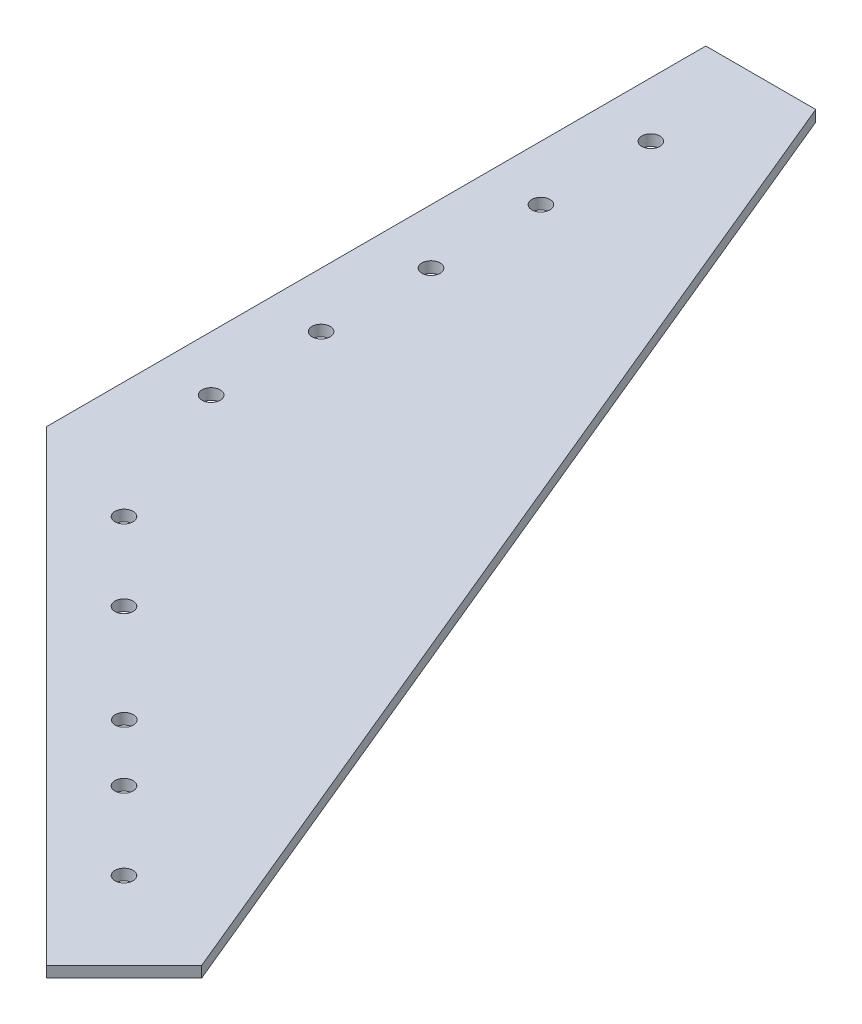
ISO-10303-21;
HEADER;
FILE_DESCRIPTION(('STEP AP214'),'2;1');
FILE_NAME('part.step','',(''),(''),'','','');
FILE_SCHEMA(('AUTOMOTIVE_DESIGN { 1 0 10303 214 1 1 1 1 }'));
ENDSEC;
DATA;
#1=APPLICATION_CONTEXT('core data for automotive mechanical design processes');
#2=APPLICATION_PROTOCOL_DEFINITION('international standard','automotive_design',2000,#1);
#3=PRODUCT_CONTEXT('',#1,'mechanical');
#4=PRODUCT('Part','Part','',(#3));
#5=PRODUCT_RELATED_PRODUCT_CATEGORY('part','',(#4));
#6=PRODUCT_DEFINITION_FORMATION('','',#4);
#7=PRODUCT_DEFINITION_CONTEXT('part definition',#1,'design');
#8=PRODUCT_DEFINITION('design','',#6,#7);
#9=PRODUCT_DEFINITION_SHAPE('','',#8);
#10=(LENGTH_UNIT() NAMED_UNIT(*) SI_UNIT(.MILLI.,.METRE.));
#11=(NAMED_UNIT(*) PLANE_ANGLE_UNIT() SI_UNIT($,.RADIAN.));
#12=(NAMED_UNIT(*) SI_UNIT($,.STERADIAN.) SOLID_ANGLE_UNIT());
#13=UNCERTAINTY_MEASURE_WITH_UNIT(LENGTH_MEASURE(1.E-05),#10,'distance_accuracy_value','');
#14=(GEOMETRIC_REPRESENTATION_CONTEXT(3) GLOBAL_UNCERTAINTY_ASSIGNED_CONTEXT((#13)) GLOBAL_UNIT_ASSIGNED_CONTEXT((#10,
#11,#12)) REPRESENTATION_CONTEXT('',''));
#15=CARTESIAN_POINT('',(0.,0.,0.));
#16=DIRECTION('',(0.,0.,1.));
#17=DIRECTION('',(1.,0.,0.));
#18=AXIS2_PLACEMENT_3D('',#15,#16,#17);
#19=CARTESIAN_POINT('',(0.,2.54,0.));
#20=DIRECTION('',(0.,0.,1.));
#21=DIRECTION('',(1.,0.,0.));
#22=AXIS2_PLACEMENT_3D('',#19,#20,#21);
#23=PLANE('',#22);
#24=DIRECTION('',(-1.,0.,0.));
#25=VECTOR('',#24,1.);
#26=CARTESIAN_POINT('',(0.,0.,0.));
#27=LINE('',#26,#25);
#28=CARTESIAN_POINT('',(25.4,0.,0.));
#29=VERTEX_POINT('',#28);
#30=CARTESIAN_POINT('',(0.,0.,0.));
#31=VERTEX_POINT('',#30);
#32=EDGE_CURVE('E129',#29,#31,#27,.T.);
#33=ORIENTED_EDGE('',*,*,#32,.T.);
#34=DIRECTION('',(0.,-1.,0.));
#35=VECTOR('',#34,1.);
#36=CARTESIAN_POINT('',(0.,2.54,0.));
#37=LINE('',#36,#35);
#38=CARTESIAN_POINT('',(0.,2.54,0.));
#39=VERTEX_POINT('',#38);
#40=EDGE_CURVE('E11',#39,#31,#37,.T.);
#41=ORIENTED_EDGE('',*,*,#40,.F.);
#42=DIRECTION('',(-1.,0.,0.));
#43=VECTOR('',#42,1.);
#44=CARTESIAN_POINT('',(0.,2.54,0.));
#45=LINE('',#44,#43);
#46=CARTESIAN_POINT('',(25.4,2.54,0.));
#47=VERTEX_POINT('',#46);
#48=EDGE_CURVE('E143',#47,#39,#45,.T.);
#49=ORIENTED_EDGE('',*,*,#48,.F.);
#50=DIRECTION('',(0.,-1.,0.));
#51=VECTOR('',#50,1.);
#52=CARTESIAN_POINT('',(25.4,2.54,0.));
#53=LINE('',#52,#51);
#54=EDGE_CURVE('E125',#47,#29,#53,.T.);
#55=ORIENTED_EDGE('',*,*,#54,.T.);
#56=EDGE_LOOP('',(#33,#41,#49,#55));
#57=FACE_BOUND('',#56,.T.);
#58=ADVANCED_FACE('F39',(#57),#23,.F.);
#59=CARTESIAN_POINT('',(0.,2.54,0.));
#60=DIRECTION('',(1.,0.,0.));
#61=DIRECTION('',(0.,0.,-1.));
#62=AXIS2_PLACEMENT_3D('',#59,#60,#61);
#63=PLANE('',#62);
#64=DIRECTION('',(0.,0.,1.));
#65=VECTOR('',#64,1.);
#66=CARTESIAN_POINT('',(0.,0.,0.));
#67=LINE('',#66,#65);
#68=CARTESIAN_POINT('',(0.,0.,152.4));
#69=VERTEX_POINT('',#68);
#70=EDGE_CURVE('E133',#31,#69,#67,.T.);
#71=ORIENTED_EDGE('',*,*,#70,.T.);
#72=DIRECTION('',(0.,-1.,0.));
#73=VECTOR('',#72,1.);
#74=CARTESIAN_POINT('',(0.,2.54,152.4));
#75=LINE('',#74,#73);
#76=CARTESIAN_POINT('',(0.,2.54,152.4));
#77=VERTEX_POINT('',#76);
#78=EDGE_CURVE('E48',#77,#69,#75,.T.);
#79=ORIENTED_EDGE('',*,*,#78,.F.);
#80=DIRECTION('',(0.,0.,1.));
#81=VECTOR('',#80,1.);
#82=CARTESIAN_POINT('',(0.,2.54,0.));
#83=LINE('',#82,#81);
#84=EDGE_CURVE('E99',#39,#77,#83,.T.);
#85=ORIENTED_EDGE('',*,*,#84,.F.);
#86=ORIENTED_EDGE('',*,*,#40,.T.);
#87=EDGE_LOOP('',(#71,#79,#85,#86));
#88=FACE_BOUND('',#87,.T.);
#89=ADVANCED_FACE('F168',(#88),#63,.F.);
#90=CARTESIAN_POINT('',(0.,2.54,152.4));
#91=DIRECTION('',(0.707106781186546,0.,-0.707106781186549));
#92=DIRECTION('',(-0.707106781186549,0.,-0.707106781186546));
#93=AXIS2_PLACEMENT_3D('',#90,#91,#92);
#94=PLANE('',#93);
#95=DIRECTION('',(0.707106781186549,0.,0.707106781186546));
#96=VECTOR('',#95,1.);
#97=CARTESIAN_POINT('',(0.,0.,152.4));
#98=LINE('',#97,#96);
#99=CARTESIAN_POINT('',(107.76307345283,0.,260.16307345283));
#100=VERTEX_POINT('',#99);
#101=EDGE_CURVE('E116',#69,#100,#98,.T.);
#102=ORIENTED_EDGE('',*,*,#101,.T.);
#103=DIRECTION('',(0.,-1.,0.));
#104=VECTOR('',#103,1.);
#105=CARTESIAN_POINT('',(107.76307345283,2.54,260.16307345283));
#106=LINE('',#105,#104);
#107=CARTESIAN_POINT('',(107.76307345283,2.54,260.16307345283));
#108=VERTEX_POINT('',#107);
#109=EDGE_CURVE('E113',#108,#100,#106,.T.);
#110=ORIENTED_EDGE('',*,*,#109,.F.);
#111=DIRECTION('',(0.707106781186549,0.,0.707106781186546));
#112=VECTOR('',#111,1.);
#113=CARTESIAN_POINT('',(0.,2.54,152.4));
#114=LINE('',#113,#112);
#115=EDGE_CURVE('E104',#77,#108,#114,.T.);
#116=ORIENTED_EDGE('',*,*,#115,.F.);
#117=ORIENTED_EDGE('',*,*,#78,.T.);
#118=EDGE_LOOP('',(#102,#110,#116,#117));
#119=FACE_BOUND('',#118,.T.);
#120=ADVANCED_FACE('F114',(#119),#94,.F.);
#121=CARTESIAN_POINT('',(107.76307345283,2.54,260.16307345283));
#122=DIRECTION('',(-0.707106781186549,0.,-0.707106781186546));
#123=DIRECTION('',(-0.707106781186546,0.,0.707106781186549));
#124=AXIS2_PLACEMENT_3D('',#121,#122,#123);
#125=PLANE('',#124);
#126=DIRECTION('',(0.707106781186546,0.,-0.707106781186549));
#127=VECTOR('',#126,1.);
#128=CARTESIAN_POINT('',(107.76307345283,0.,260.16307345283));
#129=LINE('',#128,#127);
#130=CARTESIAN_POINT('',(125.723585694968,0.,242.202561210691));
#131=VERTEX_POINT('',#130);
#132=EDGE_CURVE('E84',#100,#131,#129,.T.);
#133=ORIENTED_EDGE('',*,*,#132,.T.);
#134=DIRECTION('',(0.,-1.,0.));
#135=VECTOR('',#134,1.);
#136=CARTESIAN_POINT('',(125.723585694968,2.54,242.202561210691));
#137=LINE('',#136,#135);
#138=CARTESIAN_POINT('',(125.723585694968,2.54,242.202561210691));
#139=VERTEX_POINT('',#138);
#140=EDGE_CURVE('E118',#139,#131,#137,.T.);
#141=ORIENTED_EDGE('',*,*,#140,.F.);
#142=DIRECTION('',(0.707106781186546,0.,-0.707106781186549));
#143=VECTOR('',#142,1.);
#144=CARTESIAN_POINT('',(107.76307345283,2.54,260.16307345283));
#145=LINE('',#144,#143);
#146=EDGE_CURVE('E108',#108,#139,#145,.T.);
#147=ORIENTED_EDGE('',*,*,#146,.F.);
#148=ORIENTED_EDGE('',*,*,#109,.T.);
#149=EDGE_LOOP('',(#133,#141,#147,#148));
#150=FACE_BOUND('',#149,.T.);
#151=ADVANCED_FACE('F120',(#150),#125,.F.);
#152=CARTESIAN_POINT('',(25.4,2.54,0.));
#153=DIRECTION('',(-0.923879532511286,0.,0.382683432365091));
#154=DIRECTION('',(0.382683432365091,0.,0.923879532511286));
#155=AXIS2_PLACEMENT_3D('',#152,#153,#154);
#156=PLANE('',#155);
#157=DIRECTION('',(-0.382683432365091,0.,-0.923879532511286));
#158=VECTOR('',#157,1.);
#159=CARTESIAN_POINT('',(25.4,0.,0.));
#160=LINE('',#159,#158);
#161=EDGE_CURVE('E91',#131,#29,#160,.T.);
#162=ORIENTED_EDGE('',*,*,#161,.T.);
#163=ORIENTED_EDGE('',*,*,#54,.F.);
#164=DIRECTION('',(-0.382683432365091,0.,-0.923879532511286));
#165=VECTOR('',#164,1.);
#166=CARTESIAN_POINT('',(25.4,2.54,0.));
#167=LINE('',#166,#165);
#168=EDGE_CURVE('E59',#139,#47,#167,.T.);
#169=ORIENTED_EDGE('',*,*,#168,.F.);
#170=ORIENTED_EDGE('',*,*,#140,.T.);
#171=EDGE_LOOP('',(#162,#163,#169,#170));
#172=FACE_BOUND('',#171,.T.);
#173=ADVANCED_FACE('F155',(#172),#156,.F.);
#174=CARTESIAN_POINT('',(0.,2.54,0.));
#175=DIRECTION('',(0.,-1.,0.));
#176=DIRECTION('',(0.,0.,-1.));
#177=AXIS2_PLACEMENT_3D('',#174,#175,#176);
#178=PLANE('',#177);
#179=CARTESIAN_POINT('',(12.6999999999999,2.54,25.3999999999991));
#180=DIRECTION('',(0.,1.,0.));
#181=DIRECTION('',(0.,0.,1.));
#182=AXIS2_PLACEMENT_3D('',#179,#180,#181);
#183=CIRCLE('',#182,2.09549999999999);
#184=CARTESIAN_POINT('',(12.6999999999999,2.54,27.4954999999991));
#185=VERTEX_POINT('',#184);
#186=EDGE_CURVE('E307',#185,#185,#183,.T.);
#187=ORIENTED_EDGE('',*,*,#186,.F.);
#188=EDGE_LOOP('',(#187));
#189=FACE_BOUND('',#188,.T.);
#190=CARTESIAN_POINT('',(12.6999999999999,2.54,50.7999999999991));
#191=DIRECTION('',(0.,1.,0.));
#192=DIRECTION('',(0.,0.,1.));
#193=AXIS2_PLACEMENT_3D('',#190,#191,#192);
#194=CIRCLE('',#193,2.09549999999999);
#195=CARTESIAN_POINT('',(12.6999999999999,2.54,52.8954999999991));
#196=VERTEX_POINT('',#195);
#197=EDGE_CURVE('E311',#196,#196,#194,.T.);
#198=ORIENTED_EDGE('',*,*,#197,.F.);
#199=EDGE_LOOP('',(#198));
#200=FACE_BOUND('',#199,.T.);
#201=CARTESIAN_POINT('',(12.6999999999999,2.54,76.1999999999991));
#202=DIRECTION('',(0.,1.,0.));
#203=DIRECTION('',(0.,0.,1.));
#204=AXIS2_PLACEMENT_3D('',#201,#202,#203);
#205=CIRCLE('',#204,2.09549999999999);
#206=CARTESIAN_POINT('',(12.6999999999999,2.54,78.295499999999));
#207=VERTEX_POINT('',#206);
#208=EDGE_CURVE('E321',#207,#207,#205,.T.);
#209=ORIENTED_EDGE('',*,*,#208,.F.);
#210=EDGE_LOOP('',(#209));
#211=FACE_BOUND('',#210,.T.);
#212=CARTESIAN_POINT('',(12.6999999999998,2.54,101.599999999999));
#213=DIRECTION('',(0.,1.,0.));
#214=DIRECTION('',(0.,0.,1.));
#215=AXIS2_PLACEMENT_3D('',#212,#213,#214);
#216=CIRCLE('',#215,2.09549999999999);
#217=CARTESIAN_POINT('',(12.6999999999998,2.54,103.695499999999));
#218=VERTEX_POINT('',#217);
#219=EDGE_CURVE('E329',#218,#218,#216,.T.);
#220=ORIENTED_EDGE('',*,*,#219,.F.);
#221=EDGE_LOOP('',(#220));
#222=FACE_BOUND('',#221,.T.);
#223=CARTESIAN_POINT('',(12.6999999999999,2.54,126.999999999999));
#224=DIRECTION('',(0.,1.,0.));
#225=DIRECTION('',(0.,0.,1.));
#226=AXIS2_PLACEMENT_3D('',#223,#224,#225);
#227=CIRCLE('',#226,2.09549999999999);
#228=CARTESIAN_POINT('',(12.6999999999999,2.54,129.095499999999));
#229=VERTEX_POINT('',#228);
#230=EDGE_CURVE('E337',#229,#229,#227,.T.);
#231=ORIENTED_EDGE('',*,*,#230,.F.);
#232=EDGE_LOOP('',(#231));
#233=FACE_BOUND('',#232,.T.);
#234=CARTESIAN_POINT('',(26.9407683632077,2.54,161.38025612107));
#235=DIRECTION('',(0.,1.,0.));
#236=DIRECTION('',(0.,0.,1.));
#237=AXIS2_PLACEMENT_3D('',#234,#235,#236);
#238=CIRCLE('',#237,2.09549999999999);
#239=CARTESIAN_POINT('',(26.9407683632077,2.54,163.47575612107));
#240=VERTEX_POINT('',#239);
#241=EDGE_CURVE('E345',#240,#240,#238,.T.);
#242=ORIENTED_EDGE('',*,*,#241,.F.);
#243=EDGE_LOOP('',(#242));
#244=FACE_BOUND('',#243,.T.);
#245=CARTESIAN_POINT('',(44.9012806053461,2.54,179.340768363208));
#246=DIRECTION('',(0.,1.,0.));
#247=DIRECTION('',(0.,0.,1.));
#248=AXIS2_PLACEMENT_3D('',#245,#246,#247);
#249=CIRCLE('',#248,2.09549999999999);
#250=CARTESIAN_POINT('',(44.9012806053461,2.54,181.436268363208));
#251=VERTEX_POINT('',#250);
#252=EDGE_CURVE('E351',#251,#251,#249,.T.);
#253=ORIENTED_EDGE('',*,*,#252,.F.);
#254=EDGE_LOOP('',(#253));
#255=FACE_BOUND('',#254,.T.);
#256=CARTESIAN_POINT('',(67.6551186979566,2.54,202.031501089635));
#257=DIRECTION('',(0.,1.,0.));
#258=DIRECTION('',(0.,0.,1.));
#259=AXIS2_PLACEMENT_3D('',#256,#257,#258);
#260=CIRCLE('',#259,2.09549999999999);
#261=CARTESIAN_POINT('',(67.6551186979566,2.54,204.127001089635));
#262=VERTEX_POINT('',#261);
#263=EDGE_CURVE('E359',#262,#262,#260,.T.);
#264=ORIENTED_EDGE('',*,*,#263,.F.);
#265=EDGE_LOOP('',(#264));
#266=FACE_BOUND('',#265,.T.);
#267=CARTESIAN_POINT('',(80.8223050896228,2.54,215.261792847485));
#268=DIRECTION('',(0.,1.,0.));
#269=DIRECTION('',(0.,0.,1.));
#270=AXIS2_PLACEMENT_3D('',#267,#268,#269);
#271=CIRCLE('',#270,2.09549999999999);
#272=CARTESIAN_POINT('',(80.8223050896228,2.54,217.357292847485));
#273=VERTEX_POINT('',#272);
#274=EDGE_CURVE('E367',#273,#273,#271,.T.);
#275=ORIENTED_EDGE('',*,*,#274,.F.);
#276=EDGE_LOOP('',(#275));
#277=FACE_BOUND('',#276,.T.);
#278=CARTESIAN_POINT('',(98.7828173317611,2.54,233.222305089623));
#279=DIRECTION('',(0.,1.,0.));
#280=DIRECTION('',(0.,0.,1.));
#281=AXIS2_PLACEMENT_3D('',#278,#279,#280);
#282=CIRCLE('',#281,2.09549999999999);
#283=CARTESIAN_POINT('',(98.7828173317611,2.54,235.317805089623));
#284=VERTEX_POINT('',#283);
#285=EDGE_CURVE('E375',#284,#284,#282,.T.);
#286=ORIENTED_EDGE('',*,*,#285,.F.);
#287=EDGE_LOOP('',(#286));
#288=FACE_BOUND('',#287,.T.);
#289=ORIENTED_EDGE('',*,*,#48,.T.);
#290=ORIENTED_EDGE('',*,*,#84,.T.);
#291=ORIENTED_EDGE('',*,*,#115,.T.);
#292=ORIENTED_EDGE('',*,*,#146,.T.);
#293=ORIENTED_EDGE('',*,*,#168,.T.);
#294=EDGE_LOOP('',(#289,#290,#291,#292,#293));
#295=FACE_BOUND('',#294,.T.);
#296=ADVANCED_FACE('F106',(#189,#200,#211,#222,#233,#244,#255,#266,#277,#288,#295),#178,.F.);
#297=CARTESIAN_POINT('',(0.,0.,0.));
#298=DIRECTION('',(0.,-1.,0.));
#299=DIRECTION('',(0.,0.,-1.));
#300=AXIS2_PLACEMENT_3D('',#297,#298,#299);
#301=PLANE('',#300);
#302=CARTESIAN_POINT('',(12.6999999999999,0.,25.3999999999991));
#303=DIRECTION('',(0.,1.,0.));
#304=DIRECTION('',(0.,0.,1.));
#305=AXIS2_PLACEMENT_3D('',#302,#303,#304);
#306=CIRCLE('',#305,2.09549999999999);
#307=CARTESIAN_POINT('',(12.6999999999999,0.,27.4954999999991));
#308=VERTEX_POINT('',#307);
#309=EDGE_CURVE('E304',#308,#308,#306,.T.);
#310=ORIENTED_EDGE('',*,*,#309,.T.);
#311=EDGE_LOOP('',(#310));
#312=FACE_BOUND('',#311,.T.);
#313=CARTESIAN_POINT('',(12.6999999999999,0.,50.7999999999991));
#314=DIRECTION('',(0.,1.,0.));
#315=DIRECTION('',(0.,0.,1.));
#316=AXIS2_PLACEMENT_3D('',#313,#314,#315);
#317=CIRCLE('',#316,2.09549999999999);
#318=CARTESIAN_POINT('',(12.6999999999999,0.,52.8954999999991));
#319=VERTEX_POINT('',#318);
#320=EDGE_CURVE('E317',#319,#319,#317,.T.);
#321=ORIENTED_EDGE('',*,*,#320,.T.);
#322=EDGE_LOOP('',(#321));
#323=FACE_BOUND('',#322,.T.);
#324=CARTESIAN_POINT('',(12.6999999999999,0.,76.1999999999991));
#325=DIRECTION('',(0.,1.,0.));
#326=DIRECTION('',(0.,0.,1.));
#327=AXIS2_PLACEMENT_3D('',#324,#325,#326);
#328=CIRCLE('',#327,2.09549999999999);
#329=CARTESIAN_POINT('',(12.6999999999999,0.,78.295499999999));
#330=VERTEX_POINT('',#329);
#331=EDGE_CURVE('E325',#330,#330,#328,.T.);
#332=ORIENTED_EDGE('',*,*,#331,.T.);
#333=EDGE_LOOP('',(#332));
#334=FACE_BOUND('',#333,.T.);
#335=CARTESIAN_POINT('',(12.6999999999998,0.,101.599999999999));
#336=DIRECTION('',(0.,1.,0.));
#337=DIRECTION('',(0.,0.,1.));
#338=AXIS2_PLACEMENT_3D('',#335,#336,#337);
#339=CIRCLE('',#338,2.09549999999999);
#340=CARTESIAN_POINT('',(12.6999999999998,0.,103.695499999999));
#341=VERTEX_POINT('',#340);
#342=EDGE_CURVE('E333',#341,#341,#339,.T.);
#343=ORIENTED_EDGE('',*,*,#342,.T.);
#344=EDGE_LOOP('',(#343));
#345=FACE_BOUND('',#344,.T.);
#346=CARTESIAN_POINT('',(12.6999999999999,0.,126.999999999999));
#347=DIRECTION('',(0.,1.,0.));
#348=DIRECTION('',(0.,0.,1.));
#349=AXIS2_PLACEMENT_3D('',#346,#347,#348);
#350=CIRCLE('',#349,2.09549999999999);
#351=CARTESIAN_POINT('',(12.6999999999999,0.,129.095499999999));
#352=VERTEX_POINT('',#351);
#353=EDGE_CURVE('E341',#352,#352,#350,.T.);
#354=ORIENTED_EDGE('',*,*,#353,.T.);
#355=EDGE_LOOP('',(#354));
#356=FACE_BOUND('',#355,.T.);
#357=CARTESIAN_POINT('',(26.9407683632077,0.,161.38025612107));
#358=DIRECTION('',(0.,1.,0.));
#359=DIRECTION('',(0.,0.,1.));
#360=AXIS2_PLACEMENT_3D('',#357,#358,#359);
#361=CIRCLE('',#360,2.09549999999999);
#362=CARTESIAN_POINT('',(26.9407683632077,0.,163.47575612107));
#363=VERTEX_POINT('',#362);
#364=EDGE_CURVE('E348',#363,#363,#361,.T.);
#365=ORIENTED_EDGE('',*,*,#364,.T.);
#366=EDGE_LOOP('',(#365));
#367=FACE_BOUND('',#366,.T.);
#368=CARTESIAN_POINT('',(44.9012806053461,0.,179.340768363208));
#369=DIRECTION('',(0.,1.,0.));
#370=DIRECTION('',(0.,0.,1.));
#371=AXIS2_PLACEMENT_3D('',#368,#369,#370);
#372=CIRCLE('',#371,2.09549999999999);
#373=CARTESIAN_POINT('',(44.9012806053461,0.,181.436268363208));
#374=VERTEX_POINT('',#373);
#375=EDGE_CURVE('E355',#374,#374,#372,.T.);
#376=ORIENTED_EDGE('',*,*,#375,.T.);
#377=EDGE_LOOP('',(#376));
#378=FACE_BOUND('',#377,.T.);
#379=CARTESIAN_POINT('',(67.6551186979566,0.,202.031501089635));
#380=DIRECTION('',(0.,1.,0.));
#381=DIRECTION('',(0.,0.,1.));
#382=AXIS2_PLACEMENT_3D('',#379,#380,#381);
#383=CIRCLE('',#382,2.09549999999999);
#384=CARTESIAN_POINT('',(67.6551186979566,0.,204.127001089635));
#385=VERTEX_POINT('',#384);
#386=EDGE_CURVE('E363',#385,#385,#383,.T.);
#387=ORIENTED_EDGE('',*,*,#386,.T.);
#388=EDGE_LOOP('',(#387));
#389=FACE_BOUND('',#388,.T.);
#390=CARTESIAN_POINT('',(80.8223050896228,0.,215.261792847485));
#391=DIRECTION('',(0.,1.,0.));
#392=DIRECTION('',(0.,0.,1.));
#393=AXIS2_PLACEMENT_3D('',#390,#391,#392);
#394=CIRCLE('',#393,2.09549999999999);
#395=CARTESIAN_POINT('',(80.8223050896228,0.,217.357292847485));
#396=VERTEX_POINT('',#395);
#397=EDGE_CURVE('E371',#396,#396,#394,.T.);
#398=ORIENTED_EDGE('',*,*,#397,.T.);
#399=EDGE_LOOP('',(#398));
#400=FACE_BOUND('',#399,.T.);
#401=CARTESIAN_POINT('',(98.7828173317611,0.,233.222305089623));
#402=DIRECTION('',(0.,1.,0.));
#403=DIRECTION('',(0.,0.,1.));
#404=AXIS2_PLACEMENT_3D('',#401,#402,#403);
#405=CIRCLE('',#404,2.09549999999999);
#406=CARTESIAN_POINT('',(98.7828173317611,0.,235.317805089623));
#407=VERTEX_POINT('',#406);
#408=EDGE_CURVE('E134',#407,#407,#405,.T.);
#409=ORIENTED_EDGE('',*,*,#408,.T.);
#410=EDGE_LOOP('',(#409));
#411=FACE_BOUND('',#410,.T.);
#412=ORIENTED_EDGE('',*,*,#32,.F.);
#413=ORIENTED_EDGE('',*,*,#161,.F.);
#414=ORIENTED_EDGE('',*,*,#132,.F.);
#415=ORIENTED_EDGE('',*,*,#101,.F.);
#416=ORIENTED_EDGE('',*,*,#70,.F.);
#417=EDGE_LOOP('',(#412,#413,#414,#415,#416));
#418=FACE_BOUND('',#417,.T.);
#419=ADVANCED_FACE('F151',(#312,#323,#334,#345,#356,#367,#378,#389,#400,#411,#418),#301,.T.);
#420=CARTESIAN_POINT('',(98.7828173317611,2.54,233.222305089623));
#421=DIRECTION('',(0.,1.,0.));
#422=DIRECTION('',(0.,0.,1.));
#423=AXIS2_PLACEMENT_3D('',#420,#421,#422);
#424=CYLINDRICAL_SURFACE('',#423,2.09549999999999);
#425=ORIENTED_EDGE('',*,*,#408,.F.);
#426=EDGE_LOOP('',(#425));
#427=FACE_BOUND('',#426,.T.);
#428=ORIENTED_EDGE('',*,*,#285,.T.);
#429=EDGE_LOOP('',(#428));
#430=FACE_BOUND('',#429,.T.);
#431=ADVANCED_FACE('F199',(#427,#430),#424,.F.);
#432=CARTESIAN_POINT('',(80.8223050896228,2.54,215.261792847485));
#433=DIRECTION('',(0.,1.,0.));
#434=DIRECTION('',(0.,0.,1.));
#435=AXIS2_PLACEMENT_3D('',#432,#433,#434);
#436=CYLINDRICAL_SURFACE('',#435,2.09549999999999);
#437=ORIENTED_EDGE('',*,*,#397,.F.);
#438=EDGE_LOOP('',(#437));
#439=FACE_BOUND('',#438,.T.);
#440=ORIENTED_EDGE('',*,*,#274,.T.);
#441=EDGE_LOOP('',(#440));
#442=FACE_BOUND('',#441,.T.);
#443=ADVANCED_FACE('F207',(#439,#442),#436,.F.);
#444=CARTESIAN_POINT('',(67.6551186979566,2.54,202.031501089635));
#445=DIRECTION('',(0.,1.,0.));
#446=DIRECTION('',(0.,0.,1.));
#447=AXIS2_PLACEMENT_3D('',#444,#445,#446);
#448=CYLINDRICAL_SURFACE('',#447,2.09549999999999);
#449=ORIENTED_EDGE('',*,*,#386,.F.);
#450=EDGE_LOOP('',(#449));
#451=FACE_BOUND('',#450,.T.);
#452=ORIENTED_EDGE('',*,*,#263,.T.);
#453=EDGE_LOOP('',(#452));
#454=FACE_BOUND('',#453,.T.);
#455=ADVANCED_FACE('F217',(#451,#454),#448,.F.);
#456=CARTESIAN_POINT('',(44.9012806053461,2.54,179.340768363208));
#457=DIRECTION('',(0.,1.,0.));
#458=DIRECTION('',(0.,0.,1.));
#459=AXIS2_PLACEMENT_3D('',#456,#457,#458);
#460=CYLINDRICAL_SURFACE('',#459,2.09549999999999);
#461=ORIENTED_EDGE('',*,*,#375,.F.);
#462=EDGE_LOOP('',(#461));
#463=FACE_BOUND('',#462,.T.);
#464=ORIENTED_EDGE('',*,*,#252,.T.);
#465=EDGE_LOOP('',(#464));
#466=FACE_BOUND('',#465,.T.);
#467=ADVANCED_FACE('F227',(#463,#466),#460,.F.);
#468=CARTESIAN_POINT('',(26.9407683632077,2.54,161.38025612107));
#469=DIRECTION('',(0.,1.,0.));
#470=DIRECTION('',(0.,0.,1.));
#471=AXIS2_PLACEMENT_3D('',#468,#469,#470);
#472=CYLINDRICAL_SURFACE('',#471,2.09549999999999);
#473=ORIENTED_EDGE('',*,*,#364,.F.);
#474=EDGE_LOOP('',(#473));
#475=FACE_BOUND('',#474,.T.);
#476=ORIENTED_EDGE('',*,*,#241,.T.);
#477=EDGE_LOOP('',(#476));
#478=FACE_BOUND('',#477,.T.);
#479=ADVANCED_FACE('F237',(#475,#478),#472,.F.);
#480=CARTESIAN_POINT('',(12.6999999999999,2.54,126.999999999999));
#481=DIRECTION('',(0.,1.,0.));
#482=DIRECTION('',(0.,0.,1.));
#483=AXIS2_PLACEMENT_3D('',#480,#481,#482);
#484=CYLINDRICAL_SURFACE('',#483,2.09549999999999);
#485=ORIENTED_EDGE('',*,*,#353,.F.);
#486=EDGE_LOOP('',(#485));
#487=FACE_BOUND('',#486,.T.);
#488=ORIENTED_EDGE('',*,*,#230,.T.);
#489=EDGE_LOOP('',(#488));
#490=FACE_BOUND('',#489,.T.);
#491=ADVANCED_FACE('F247',(#487,#490),#484,.F.);
#492=CARTESIAN_POINT('',(12.6999999999998,2.54,101.599999999999));
#493=DIRECTION('',(0.,1.,0.));
#494=DIRECTION('',(0.,0.,1.));
#495=AXIS2_PLACEMENT_3D('',#492,#493,#494);
#496=CYLINDRICAL_SURFACE('',#495,2.09549999999999);
#497=ORIENTED_EDGE('',*,*,#342,.F.);
#498=EDGE_LOOP('',(#497));
#499=FACE_BOUND('',#498,.T.);
#500=ORIENTED_EDGE('',*,*,#219,.T.);
#501=EDGE_LOOP('',(#500));
#502=FACE_BOUND('',#501,.T.);
#503=ADVANCED_FACE('F257',(#499,#502),#496,.F.);
#504=CARTESIAN_POINT('',(12.6999999999999,2.54,76.1999999999991));
#505=DIRECTION('',(0.,1.,0.));
#506=DIRECTION('',(0.,0.,1.));
#507=AXIS2_PLACEMENT_3D('',#504,#505,#506);
#508=CYLINDRICAL_SURFACE('',#507,2.09549999999999);
#509=ORIENTED_EDGE('',*,*,#331,.F.);
#510=EDGE_LOOP('',(#509));
#511=FACE_BOUND('',#510,.T.);
#512=ORIENTED_EDGE('',*,*,#208,.T.);
#513=EDGE_LOOP('',(#512));
#514=FACE_BOUND('',#513,.T.);
#515=ADVANCED_FACE('F267',(#511,#514),#508,.F.);
#516=CARTESIAN_POINT('',(12.6999999999999,2.54,50.7999999999991));
#517=DIRECTION('',(0.,1.,0.));
#518=DIRECTION('',(0.,0.,1.));
#519=AXIS2_PLACEMENT_3D('',#516,#517,#518);
#520=CYLINDRICAL_SURFACE('',#519,2.09549999999999);
#521=ORIENTED_EDGE('',*,*,#320,.F.);
#522=EDGE_LOOP('',(#521));
#523=FACE_BOUND('',#522,.T.);
#524=ORIENTED_EDGE('',*,*,#197,.T.);
#525=EDGE_LOOP('',(#524));
#526=FACE_BOUND('',#525,.T.);
#527=ADVANCED_FACE('F277',(#523,#526),#520,.F.);
#528=CARTESIAN_POINT('',(12.6999999999999,2.54,25.3999999999991));
#529=DIRECTION('',(0.,1.,0.));
#530=DIRECTION('',(0.,0.,1.));
#531=AXIS2_PLACEMENT_3D('',#528,#529,#530);
#532=CYLINDRICAL_SURFACE('',#531,2.09549999999999);
#533=ORIENTED_EDGE('',*,*,#309,.F.);
#534=EDGE_LOOP('',(#533));
#535=FACE_BOUND('',#534,.T.);
#536=ORIENTED_EDGE('',*,*,#186,.T.);
#537=EDGE_LOOP('',(#536));
#538=FACE_BOUND('',#537,.T.);
#539=ADVANCED_FACE('F287',(#535,#538),#532,.F.);
#540=CLOSED_SHELL('',(#58,#89,#120,#151,#173,#296,#419,#431,#443,#455,#467,#479,#491,#503,#515,
#527,#539));
#541=MANIFOLD_SOLID_BREP('B2',#540);
#542=ADVANCED_BREP_SHAPE_REPRESENTATION('',(#18,#541),#14);
#543=SHAPE_DEFINITION_REPRESENTATION(#9,#542);
ENDSEC;
END-ISO-10303-21;
